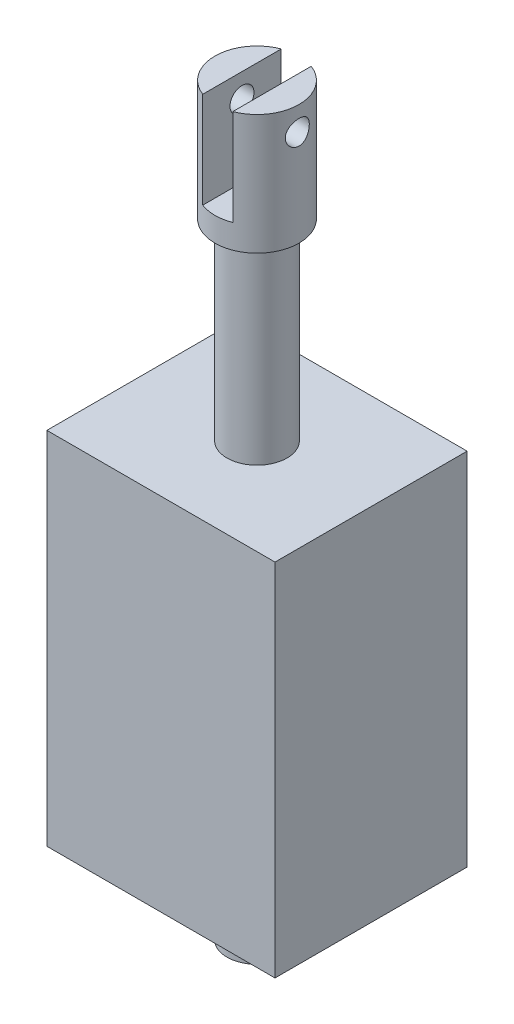
ISO-10303-21;
HEADER;
FILE_DESCRIPTION(('STEP AP214'),'2;1');
FILE_NAME('part.step','',(''),(''),'','','');
FILE_SCHEMA(('AUTOMOTIVE_DESIGN { 1 0 10303 214 1 1 1 1 }'));
ENDSEC;
DATA;
#1=APPLICATION_CONTEXT('core data for automotive mechanical design processes');
#2=APPLICATION_PROTOCOL_DEFINITION('international standard','automotive_design',2000,#1);
#3=PRODUCT_CONTEXT('',#1,'mechanical');
#4=PRODUCT('Part','Part','',(#3));
#5=PRODUCT_RELATED_PRODUCT_CATEGORY('part','',(#4));
#6=PRODUCT_DEFINITION_FORMATION('','',#4);
#7=PRODUCT_DEFINITION_CONTEXT('part definition',#1,'design');
#8=PRODUCT_DEFINITION('design','',#6,#7);
#9=PRODUCT_DEFINITION_SHAPE('','',#8);
#10=(LENGTH_UNIT() NAMED_UNIT(*) SI_UNIT(.MILLI.,.METRE.));
#11=(NAMED_UNIT(*) PLANE_ANGLE_UNIT() SI_UNIT($,.RADIAN.));
#12=(NAMED_UNIT(*) SI_UNIT($,.STERADIAN.) SOLID_ANGLE_UNIT());
#13=UNCERTAINTY_MEASURE_WITH_UNIT(LENGTH_MEASURE(1.E-05),#10,'distance_accuracy_value','');
#14=(GEOMETRIC_REPRESENTATION_CONTEXT(3) GLOBAL_UNCERTAINTY_ASSIGNED_CONTEXT((#13)) GLOBAL_UNIT_ASSIGNED_CONTEXT((#10,
#11,#12)) REPRESENTATION_CONTEXT('',''));
#15=CARTESIAN_POINT('',(0.,0.,0.));
#16=DIRECTION('',(0.,0.,1.));
#17=DIRECTION('',(1.,0.,0.));
#18=AXIS2_PLACEMENT_3D('',#15,#16,#17);
#19=CARTESIAN_POINT('',(0.,56.,0.));
#20=DIRECTION('',(0.,1.,0.));
#21=DIRECTION('',(0.,0.,1.));
#22=AXIS2_PLACEMENT_3D('',#19,#20,#21);
#23=PLANE('',#22);
#24=DIRECTION('',(0.,0.,1.));
#25=VECTOR('',#24,1.);
#26=CARTESIAN_POINT('',(-1.25,56.,-8.00000000000004));
#27=LINE('',#26,#25);
#28=CARTESIAN_POINT('',(-1.25,56.,-3.26917420765551));
#29=VERTEX_POINT('',#28);
#30=CARTESIAN_POINT('',(-1.25,56.,3.26917420765551));
#31=VERTEX_POINT('',#30);
#32=EDGE_CURVE('E198',#29,#31,#27,.T.);
#33=ORIENTED_EDGE('',*,*,#32,.F.);
#34=CARTESIAN_POINT('',(0.,56.,0.));
#35=DIRECTION('',(0.,1.,0.));
#36=DIRECTION('',(0.,0.,1.));
#37=AXIS2_PLACEMENT_3D('',#34,#35,#36);
#38=CIRCLE('',#37,3.5);
#39=EDGE_CURVE('E200',#29,#31,#38,.T.);
#40=ORIENTED_EDGE('',*,*,#39,.T.);
#41=EDGE_LOOP('',(#33,#40));
#42=FACE_BOUND('',#41,.T.);
#43=ADVANCED_FACE('F45',(#42),#23,.T.);
#44=CARTESIAN_POINT('',(-9.49999999999996,54.,0.));
#45=DIRECTION('',(1.,0.,0.));
#46=DIRECTION('',(0.,0.,-1.));
#47=AXIS2_PLACEMENT_3D('',#44,#45,#46);
#48=CYLINDRICAL_SURFACE('',#47,1.);
#49=CARTESIAN_POINT('',(-1.25,54.,0.));
#50=DIRECTION('',(-1.,0.,0.));
#51=DIRECTION('',(0.,-1.,0.));
#52=AXIS2_PLACEMENT_3D('',#49,#50,#51);
#53=CIRCLE('',#52,1.);
#54=CARTESIAN_POINT('',(-1.25,53.,0.));
#55=VERTEX_POINT('',#54);
#56=EDGE_CURVE('E266',#55,#55,#53,.F.);
#57=ORIENTED_EDGE('',*,*,#56,.T.);
#58=EDGE_LOOP('',(#57));
#59=FACE_BOUND('',#58,.T.);
#60=CARTESIAN_POINT('',(-3.35410196624968,54.,-1.));
#61=CARTESIAN_POINT('',(-3.3541027352982,54.0549257689227,-0.999999010234619));
#62=CARTESIAN_POINT('',(-3.35546589937234,54.1098615420798,-0.995459333009395));
#63=CARTESIAN_POINT('',(-3.36075194701915,54.2181356193875,-0.977461816962149));
#64=CARTESIAN_POINT('',(-3.36467587174621,54.2714732645416,-0.9640003506833));
#65=CARTESIAN_POINT('',(-3.37460354734501,54.3749686004512,-0.928646716460412));
#66=CARTESIAN_POINT('',(-3.38060407621639,54.4251310759127,-0.906767603258324));
#67=CARTESIAN_POINT('',(-3.39400460555119,54.521083905773,-0.855241820315746));
#68=CARTESIAN_POINT('',(-3.40140477214508,54.5668737401879,-0.825594228332021));
#69=CARTESIAN_POINT('',(-3.41700891605117,54.6540957826586,-0.758462400490703));
#70=CARTESIAN_POINT('',(-3.42522877981549,54.6953839010649,-0.720794605566173));
#71=CARTESIAN_POINT('',(-3.44140982756535,54.7711513916516,-0.639085622734719));
#72=CARTESIAN_POINT('',(-3.44937098116968,54.8056299665613,-0.595043689579842));
#73=CARTESIAN_POINT('',(-3.46431666000611,54.8674143241768,-0.500823016078778));
#74=CARTESIAN_POINT('',(-3.47128027250394,54.8945748098755,-0.450545391880933));
#75=CARTESIAN_POINT('',(-3.48326270242804,54.940000887208,-0.34590423761983));
#76=CARTESIAN_POINT('',(-3.48828189845443,54.9582682106201,-0.291541505437591));
#77=CARTESIAN_POINT('',(-3.49569759650108,54.9849172306199,-0.181779287560589));
#78=CARTESIAN_POINT('',(-3.49815913505649,54.9935445108523,-0.126443899064521));
#79=CARTESIAN_POINT('',(-3.50041047829849,55.0014433669416,-0.0150600512109633));
#80=CARTESIAN_POINT('',(-3.50020079369491,55.0007167311687,0.0409882697942736));
#81=CARTESIAN_POINT('',(-3.49718003381653,54.990096812541,0.15049009786761));
#82=CARTESIAN_POINT('',(-3.49444435388027,54.980469193681,0.203971773054473));
#83=CARTESIAN_POINT('',(-3.48676943165067,54.9527524487678,0.308526111088809));
#84=CARTESIAN_POINT('',(-3.48183005528105,54.9346628078689,0.359598627150255));
#85=CARTESIAN_POINT('',(-3.47019515886062,54.8903452995941,0.458536916864462));
#86=CARTESIAN_POINT('',(-3.46348102756093,54.8640306110958,0.506361521925386));
#87=CARTESIAN_POINT('',(-3.44901384486994,54.804077706801,0.59700362179524));
#88=CARTESIAN_POINT('',(-3.44126056595877,54.7704378861668,0.639820016208002));
#89=CARTESIAN_POINT('',(-3.42522841509913,54.6953971446907,0.720816324273875));
#90=CARTESIAN_POINT('',(-3.41694064685079,54.6537652831974,0.758780788792451));
#91=CARTESIAN_POINT('',(-3.4010148689311,54.5646424540771,0.827246507874875));
#92=CARTESIAN_POINT('',(-3.39337691201241,54.5171510115256,0.857747156891286));
#93=CARTESIAN_POINT('',(-3.37957587408658,54.4171345577509,0.910616679927255));
#94=CARTESIAN_POINT('',(-3.37342505474766,54.3645723874737,0.932918688943926));
#95=CARTESIAN_POINT('',(-3.36344272188227,54.2562234182481,0.968294757480382));
#96=CARTESIAN_POINT('',(-3.35961053356453,54.2004375626717,0.981371502013291));
#97=CARTESIAN_POINT('',(-3.35484557617748,54.0892597878381,0.997537085998827));
#98=CARTESIAN_POINT('',(-3.35381855730447,54.0339190915396,1.00095074078696));
#99=CARTESIAN_POINT('',(-3.35452079870229,53.9234558420425,0.998594983598456));
#100=CARTESIAN_POINT('',(-3.35624971515342,53.8683332624927,0.992826717122486));
#101=CARTESIAN_POINT('',(-3.36217715008271,53.7611793859847,0.97255890712929));
#102=CARTESIAN_POINT('',(-3.3663182147774,53.7091062069914,0.958262310920607));
#103=CARTESIAN_POINT('',(-3.37654531970352,53.6080990640021,0.921575809332241));
#104=CARTESIAN_POINT('',(-3.38263164056921,53.5591655541774,0.899184736133866));
#105=CARTESIAN_POINT('',(-3.3962509400331,53.4644889623913,0.846309825608092));
#106=CARTESIAN_POINT('',(-3.40381598690189,53.4188547778988,0.815639458645652));
#107=CARTESIAN_POINT('',(-3.41946863275287,53.3332618132784,0.747302318424217));
#108=CARTESIAN_POINT('',(-3.42755634473907,53.2933042664939,0.709634028840688));
#109=CARTESIAN_POINT('',(-3.44367363717939,53.2188102908559,0.626854004982778));
#110=CARTESIAN_POINT('',(-3.45169203023043,53.1845025142906,0.581533855120275));
#111=CARTESIAN_POINT('',(-3.46648988523027,53.1239771593086,0.485592653528774));
#112=CARTESIAN_POINT('',(-3.47326941192714,53.0977591580388,0.434971879049092));
#113=CARTESIAN_POINT('',(-3.48478252423195,53.0544078564868,0.330216636478082));
#114=CARTESIAN_POINT('',(-3.48953154063622,53.0372058052069,0.276112399949816));
#115=CARTESIAN_POINT('',(-3.49651669811944,53.0121865990299,0.16562282427496));
#116=CARTESIAN_POINT('',(-3.4987534856151,53.0043670299093,0.109238075792718));
#117=CARTESIAN_POINT('',(-3.50042667501642,52.9985042830011,-0.00208911897951537));
#118=CARTESIAN_POINT('',(-3.49995851794498,53.0001279254586,-0.0570128155249792));
#119=CARTESIAN_POINT('',(-3.49649534561067,53.0123191407051,-0.165772586211003));
#120=CARTESIAN_POINT('',(-3.49350045135296,53.022886285191,-0.219608712308766));
#121=CARTESIAN_POINT('',(-3.48534400930059,53.0524656804894,-0.324202066519794));
#122=CARTESIAN_POINT('',(-3.4802020702409,53.071401589472,-0.374982516717526));
#123=CARTESIAN_POINT('',(-3.46828547071724,53.1171130791427,-0.472673601380731));
#124=CARTESIAN_POINT('',(-3.46151055750883,53.1438898735461,-0.519583635290339));
#125=CARTESIAN_POINT('',(-3.44679477720104,53.2054486687124,-0.609716728176953));
#126=CARTESIAN_POINT('',(-3.43882522893152,53.2404450433942,-0.652788664003536));
#127=CARTESIAN_POINT('',(-3.42272032493228,53.317054562727,-0.732560611159187));
#128=CARTESIAN_POINT('',(-3.4145849239342,53.3586695355424,-0.769258856094887));
#129=CARTESIAN_POINT('',(-3.39882018772077,53.4486484584977,-0.836204230145643));
#130=CARTESIAN_POINT('',(-3.39120975884781,53.4971609737516,-0.866256583618024));
#131=CARTESIAN_POINT('',(-3.37764222665283,53.5987609326575,-0.91773971809804));
#132=CARTESIAN_POINT('',(-3.37168419857914,53.6518457955448,-0.93917532442409));
#133=CARTESIAN_POINT('',(-3.36279229780033,53.7538268501157,-0.970492670062523));
#134=CARTESIAN_POINT('',(-3.3595621942308,53.8023451740493,-0.981529499909266));
#135=CARTESIAN_POINT('',(-3.35521684727178,53.900573059178,-0.996283035217831));
#136=CARTESIAN_POINT('',(-3.35410127012429,53.950282431123,-1.00000089591333));
#137=CARTESIAN_POINT('',(-3.35410196624968,54.,-1.));
#138=B_SPLINE_CURVE_WITH_KNOTS('',3,(#60,#61,#62,#63,#64,#65,#66,#67,#68,#69,#70,#71,#72,#73,
#74,#75,#76,#77,#78,#79,#80,#81,#82,#83,#84,#85,#86,#87,#88,#89,#90,#91,#92,#93,#94,#95,#96,#97,
#98,#99,#100,#101,#102,#103,#104,#105,#106,#107,#108,#109,#110,#111,#112,#113,#114,#115,#116,
#117,#118,#119,#120,#121,#122,#123,#124,#125,#126,#127,#128,#129,#130,#131,#132,#133,#134,#135,
#136,#137),.UNSPECIFIED.,.T.,.F.,(4,2,2,2,2,2,2,2,2,2,2,2,2,2,2,2,2,2,2,2,2,2,2,2,2,2,2,2,2,2,2,
2,2,2,2,2,2,2,4),(0.,0.164594171159105,0.32925530476515,0.493662091823929,0.658088405459392,
0.826785835988794,0.995503006148128,1.16735741502495,1.33917834504425,1.50651450509943,
1.67381867271781,1.83628518817283,1.99876158968833,2.16301451684818,2.32730346587989,
2.49735806342072,2.66742645310452,2.83885260310575,3.01022883892078,3.17577181660546,
3.34129414341279,3.5030264482031,3.66478209600075,3.83054003013244,3.99633392302106,
4.16772694180382,4.33911100034378,4.50916842641099,4.67918208530373,4.84323448834084,
5.00727903537341,5.16985706186659,5.33246026763666,5.4998988436474,5.66738374949711,
5.83926806202707,6.0110559859988,6.16006644425301,6.30905338065555),.UNSPECIFIED.);
#139=CARTESIAN_POINT('',(-3.35410196624968,54.,-1.));
#140=VERTEX_POINT('',#139);
#141=EDGE_CURVE('E147',#140,#140,#138,.T.);
#142=ORIENTED_EDGE('',*,*,#141,.F.);
#143=EDGE_LOOP('',(#142));
#144=FACE_BOUND('',#143,.T.);
#145=ADVANCED_FACE('F171',(#59,#144),#48,.F.);
#146=CARTESIAN_POINT('',(9.50000000000004,30.,7.99999999999992));
#147=DIRECTION('',(-1.,0.,0.));
#148=DIRECTION('',(0.,0.,1.));
#149=AXIS2_PLACEMENT_3D('',#146,#147,#148);
#150=PLANE('',#149);
#151=DIRECTION('',(0.,0.,-1.));
#152=VECTOR('',#151,1.);
#153=CARTESIAN_POINT('',(9.50000000000004,0.,7.99999999999992));
#154=LINE('',#153,#152);
#155=CARTESIAN_POINT('',(9.50000000000004,0.,7.99999999999992));
#156=VERTEX_POINT('',#155);
#157=CARTESIAN_POINT('',(9.50000000000004,0.,-8.00000000000004));
#158=VERTEX_POINT('',#157);
#159=EDGE_CURVE('E205',#156,#158,#154,.T.);
#160=ORIENTED_EDGE('',*,*,#159,.T.);
#161=DIRECTION('',(0.,-1.,0.));
#162=VECTOR('',#161,1.);
#163=CARTESIAN_POINT('',(9.50000000000004,30.,-8.00000000000004));
#164=LINE('',#163,#162);
#165=CARTESIAN_POINT('',(9.50000000000004,30.,-8.00000000000004));
#166=VERTEX_POINT('',#165);
#167=EDGE_CURVE('E229',#166,#158,#164,.T.);
#168=ORIENTED_EDGE('',*,*,#167,.F.);
#169=DIRECTION('',(0.,0.,-1.));
#170=VECTOR('',#169,1.);
#171=CARTESIAN_POINT('',(9.50000000000004,30.,7.99999999999992));
#172=LINE('',#171,#170);
#173=CARTESIAN_POINT('',(9.50000000000004,30.,7.99999999999992));
#174=VERTEX_POINT('',#173);
#175=EDGE_CURVE('E210',#174,#166,#172,.T.);
#176=ORIENTED_EDGE('',*,*,#175,.F.);
#177=DIRECTION('',(0.,-1.,0.));
#178=VECTOR('',#177,1.);
#179=CARTESIAN_POINT('',(9.50000000000004,30.,7.99999999999992));
#180=LINE('',#179,#178);
#181=EDGE_CURVE('E216',#174,#156,#180,.T.);
#182=ORIENTED_EDGE('',*,*,#181,.T.);
#183=EDGE_LOOP('',(#160,#168,#176,#182));
#184=FACE_BOUND('',#183,.T.);
#185=ADVANCED_FACE('F47',(#184),#150,.F.);
#186=CARTESIAN_POINT('',(-9.49999999999996,30.,-8.00000000000004));
#187=DIRECTION('',(0.,0.,1.));
#188=DIRECTION('',(1.,0.,0.));
#189=AXIS2_PLACEMENT_3D('',#186,#187,#188);
#190=PLANE('',#189);
#191=DIRECTION('',(-1.,0.,0.));
#192=VECTOR('',#191,1.);
#193=CARTESIAN_POINT('',(-9.49999999999996,0.,-8.00000000000004));
#194=LINE('',#193,#192);
#195=CARTESIAN_POINT('',(-9.49999999999996,0.,-8.00000000000004));
#196=VERTEX_POINT('',#195);
#197=EDGE_CURVE('E219',#158,#196,#194,.T.);
#198=ORIENTED_EDGE('',*,*,#197,.T.);
#199=DIRECTION('',(0.,-1.,0.));
#200=VECTOR('',#199,1.);
#201=CARTESIAN_POINT('',(-9.49999999999996,30.,-8.00000000000004));
#202=LINE('',#201,#200);
#203=CARTESIAN_POINT('',(-9.49999999999996,30.,-8.00000000000004));
#204=VERTEX_POINT('',#203);
#205=EDGE_CURVE('E227',#204,#196,#202,.T.);
#206=ORIENTED_EDGE('',*,*,#205,.F.);
#207=DIRECTION('',(-1.,0.,0.));
#208=VECTOR('',#207,1.);
#209=CARTESIAN_POINT('',(-9.49999999999996,30.,-8.00000000000004));
#210=LINE('',#209,#208);
#211=EDGE_CURVE('E98',#166,#204,#210,.T.);
#212=ORIENTED_EDGE('',*,*,#211,.F.);
#213=ORIENTED_EDGE('',*,*,#167,.T.);
#214=EDGE_LOOP('',(#198,#206,#212,#213));
#215=FACE_BOUND('',#214,.T.);
#216=ADVANCED_FACE('F248',(#215),#190,.F.);
#217=CARTESIAN_POINT('',(-9.49999999999996,30.,7.99999999999992));
#218=DIRECTION('',(1.,0.,0.));
#219=DIRECTION('',(0.,0.,-1.));
#220=AXIS2_PLACEMENT_3D('',#217,#218,#219);
#221=PLANE('',#220);
#222=DIRECTION('',(0.,0.,1.));
#223=VECTOR('',#222,1.);
#224=CARTESIAN_POINT('',(-9.49999999999996,0.,7.99999999999992));
#225=LINE('',#224,#223);
#226=CARTESIAN_POINT('',(-9.49999999999996,0.,7.99999999999992));
#227=VERTEX_POINT('',#226);
#228=EDGE_CURVE('E221',#196,#227,#225,.T.);
#229=ORIENTED_EDGE('',*,*,#228,.T.);
#230=DIRECTION('',(0.,-1.,0.));
#231=VECTOR('',#230,1.);
#232=CARTESIAN_POINT('',(-9.49999999999996,30.,7.99999999999992));
#233=LINE('',#232,#231);
#234=CARTESIAN_POINT('',(-9.49999999999996,30.,7.99999999999992));
#235=VERTEX_POINT('',#234);
#236=EDGE_CURVE('E225',#235,#227,#233,.T.);
#237=ORIENTED_EDGE('',*,*,#236,.F.);
#238=DIRECTION('',(0.,0.,1.));
#239=VECTOR('',#238,1.);
#240=CARTESIAN_POINT('',(-9.49999999999996,30.,7.99999999999992));
#241=LINE('',#240,#239);
#242=EDGE_CURVE('E213',#204,#235,#241,.T.);
#243=ORIENTED_EDGE('',*,*,#242,.F.);
#244=ORIENTED_EDGE('',*,*,#205,.T.);
#245=EDGE_LOOP('',(#229,#237,#243,#244));
#246=FACE_BOUND('',#245,.T.);
#247=ADVANCED_FACE('F247',(#246),#221,.F.);
#248=CARTESIAN_POINT('',(-9.49999999999996,30.,7.99999999999992));
#249=DIRECTION('',(0.,0.,-1.));
#250=DIRECTION('',(-1.,0.,0.));
#251=AXIS2_PLACEMENT_3D('',#248,#249,#250);
#252=PLANE('',#251);
#253=DIRECTION('',(1.,0.,0.));
#254=VECTOR('',#253,1.);
#255=CARTESIAN_POINT('',(-9.49999999999996,0.,7.99999999999992));
#256=LINE('',#255,#254);
#257=EDGE_CURVE('E90',#227,#156,#256,.T.);
#258=ORIENTED_EDGE('',*,*,#257,.T.);
#259=ORIENTED_EDGE('',*,*,#181,.F.);
#260=DIRECTION('',(1.,0.,0.));
#261=VECTOR('',#260,1.);
#262=CARTESIAN_POINT('',(-9.49999999999996,30.,7.99999999999992));
#263=LINE('',#262,#261);
#264=EDGE_CURVE('E69',#235,#174,#263,.T.);
#265=ORIENTED_EDGE('',*,*,#264,.F.);
#266=ORIENTED_EDGE('',*,*,#236,.T.);
#267=EDGE_LOOP('',(#258,#259,#265,#266));
#268=FACE_BOUND('',#267,.T.);
#269=ADVANCED_FACE('F243',(#268),#252,.F.);
#270=CARTESIAN_POINT('',(0.,30.,0.));
#271=DIRECTION('',(0.,-1.,0.));
#272=DIRECTION('',(0.,0.,-1.));
#273=AXIS2_PLACEMENT_3D('',#270,#271,#272);
#274=PLANE('',#273);
#275=ORIENTED_EDGE('',*,*,#175,.T.);
#276=ORIENTED_EDGE('',*,*,#211,.T.);
#277=ORIENTED_EDGE('',*,*,#242,.T.);
#278=ORIENTED_EDGE('',*,*,#264,.T.);
#279=EDGE_LOOP('',(#275,#276,#277,#278));
#280=FACE_BOUND('',#279,.T.);
#281=CARTESIAN_POINT('',(0.,30.,0.));
#282=DIRECTION('',(0.,1.,0.));
#283=DIRECTION('',(0.,0.,1.));
#284=AXIS2_PLACEMENT_3D('',#281,#282,#283);
#285=CIRCLE('',#284,2.5);
#286=CARTESIAN_POINT('',(0.,30.,2.5));
#287=VERTEX_POINT('',#286);
#288=EDGE_CURVE('E263',#287,#287,#285,.T.);
#289=ORIENTED_EDGE('',*,*,#288,.F.);
#290=EDGE_LOOP('',(#289));
#291=FACE_BOUND('',#290,.T.);
#292=ADVANCED_FACE('F237',(#280,#291),#274,.F.);
#293=CARTESIAN_POINT('',(0.,0.,0.));
#294=DIRECTION('',(0.,-1.,0.));
#295=DIRECTION('',(0.,0.,-1.));
#296=AXIS2_PLACEMENT_3D('',#293,#294,#295);
#297=PLANE('',#296);
#298=CARTESIAN_POINT('',(0.,0.,0.));
#299=DIRECTION('',(0.,-1.,0.));
#300=DIRECTION('',(0.,0.,-1.));
#301=AXIS2_PLACEMENT_3D('',#298,#299,#300);
#302=CIRCLE('',#301,2.5);
#303=CARTESIAN_POINT('',(0.,0.,-2.5));
#304=VERTEX_POINT('',#303);
#305=EDGE_CURVE('E146',#304,#304,#302,.T.);
#306=ORIENTED_EDGE('',*,*,#305,.F.);
#307=EDGE_LOOP('',(#306));
#308=FACE_BOUND('',#307,.T.);
#309=ORIENTED_EDGE('',*,*,#159,.F.);
#310=ORIENTED_EDGE('',*,*,#257,.F.);
#311=ORIENTED_EDGE('',*,*,#228,.F.);
#312=ORIENTED_EDGE('',*,*,#197,.F.);
#313=EDGE_LOOP('',(#309,#310,#311,#312));
#314=FACE_BOUND('',#313,.T.);
#315=ADVANCED_FACE('F181',(#308,#314),#297,.T.);
#316=CARTESIAN_POINT('',(0.,-6.,0.));
#317=DIRECTION('',(0.,1.,0.));
#318=DIRECTION('',(0.,0.,1.));
#319=AXIS2_PLACEMENT_3D('',#316,#317,#318);
#320=CYLINDRICAL_SURFACE('',#319,2.5);
#321=CARTESIAN_POINT('',(0.,-6.,0.));
#322=DIRECTION('',(0.,-1.,0.));
#323=DIRECTION('',(0.,0.,-1.));
#324=AXIS2_PLACEMENT_3D('',#321,#322,#323);
#325=CIRCLE('',#324,2.5);
#326=CARTESIAN_POINT('',(0.,-6.,-2.5));
#327=VERTEX_POINT('',#326);
#328=EDGE_CURVE('E155',#327,#327,#325,.T.);
#329=ORIENTED_EDGE('',*,*,#328,.F.);
#330=EDGE_LOOP('',(#329));
#331=FACE_BOUND('',#330,.T.);
#332=ORIENTED_EDGE('',*,*,#305,.T.);
#333=EDGE_LOOP('',(#332));
#334=FACE_BOUND('',#333,.T.);
#335=ADVANCED_FACE('F178',(#331,#334),#320,.T.);
#336=CARTESIAN_POINT('',(0.,-6.,0.));
#337=DIRECTION('',(0.,-1.,0.));
#338=DIRECTION('',(0.,0.,-1.));
#339=AXIS2_PLACEMENT_3D('',#336,#337,#338);
#340=PLANE('',#339);
#341=ORIENTED_EDGE('',*,*,#328,.T.);
#342=EDGE_LOOP('',(#341));
#343=FACE_BOUND('',#342,.T.);
#344=ADVANCED_FACE('F174',(#343),#340,.T.);
#345=CARTESIAN_POINT('',(0.,46.,0.));
#346=DIRECTION('',(0.,1.,0.));
#347=DIRECTION('',(0.,0.,1.));
#348=AXIS2_PLACEMENT_3D('',#345,#346,#347);
#349=PLANE('',#348);
#350=CARTESIAN_POINT('',(0.,46.,0.));
#351=DIRECTION('',(0.,1.,0.));
#352=DIRECTION('',(0.,0.,1.));
#353=AXIS2_PLACEMENT_3D('',#350,#351,#352);
#354=CIRCLE('',#353,3.5);
#355=CARTESIAN_POINT('',(0.,46.,3.5));
#356=VERTEX_POINT('',#355);
#357=EDGE_CURVE('E269',#356,#356,#354,.T.);
#358=ORIENTED_EDGE('',*,*,#357,.F.);
#359=EDGE_LOOP('',(#358));
#360=FACE_BOUND('',#359,.T.);
#361=CARTESIAN_POINT('',(0.,46.,0.));
#362=DIRECTION('',(0.,1.,0.));
#363=DIRECTION('',(0.,0.,1.));
#364=AXIS2_PLACEMENT_3D('',#361,#362,#363);
#365=CIRCLE('',#364,2.5);
#366=CARTESIAN_POINT('',(0.,46.,2.5));
#367=VERTEX_POINT('',#366);
#368=EDGE_CURVE('E265',#367,#367,#365,.T.);
#369=ORIENTED_EDGE('',*,*,#368,.T.);
#370=EDGE_LOOP('',(#369));
#371=FACE_BOUND('',#370,.T.);
#372=ADVANCED_FACE('F172',(#360,#371),#349,.F.);
#373=CARTESIAN_POINT('',(0.,46.,0.));
#374=DIRECTION('',(0.,-1.,0.));
#375=DIRECTION('',(0.,0.,-1.));
#376=AXIS2_PLACEMENT_3D('',#373,#374,#375);
#377=CYLINDRICAL_SURFACE('',#376,2.5);
#378=ORIENTED_EDGE('',*,*,#368,.F.);
#379=EDGE_LOOP('',(#378));
#380=FACE_BOUND('',#379,.T.);
#381=ORIENTED_EDGE('',*,*,#288,.T.);
#382=EDGE_LOOP('',(#381));
#383=FACE_BOUND('',#382,.T.);
#384=ADVANCED_FACE('F184',(#380,#383),#377,.T.);
#385=DIRECTION('',(0.,0.,1.));
#386=VECTOR('',#385,1.);
#387=CARTESIAN_POINT('',(1.25,56.,-8.00000000000004));
#388=LINE('',#387,#386);
#389=CARTESIAN_POINT('',(1.25,56.,-3.26917420765551));
#390=VERTEX_POINT('',#389);
#391=CARTESIAN_POINT('',(1.25,56.,3.26917420765551));
#392=VERTEX_POINT('',#391);
#393=EDGE_CURVE('E135',#390,#392,#388,.T.);
#394=ORIENTED_EDGE('',*,*,#393,.T.);
#395=EDGE_CURVE('E141',#392,#390,#38,.T.);
#396=ORIENTED_EDGE('',*,*,#395,.T.);
#397=EDGE_LOOP('',(#394,#396));
#398=FACE_BOUND('',#397,.T.);
#399=ADVANCED_FACE('F169',(#398),#23,.T.);
#400=CARTESIAN_POINT('',(1.25,54.,0.));
#401=DIRECTION('',(1.,0.,0.));
#402=DIRECTION('',(0.,1.,0.));
#403=AXIS2_PLACEMENT_3D('',#400,#401,#402);
#404=CIRCLE('',#403,1.);
#405=CARTESIAN_POINT('',(1.25,55.,0.));
#406=VERTEX_POINT('',#405);
#407=EDGE_CURVE('E202',#406,#406,#404,.F.);
#408=ORIENTED_EDGE('',*,*,#407,.T.);
#409=EDGE_LOOP('',(#408));
#410=FACE_BOUND('',#409,.T.);
#411=CARTESIAN_POINT('',(3.35410196624969,54.,-1.));
#412=CARTESIAN_POINT('',(3.3541027352982,53.9450742310772,-0.999999010234619));
#413=CARTESIAN_POINT('',(3.35546589937234,53.8901384579202,-0.995459333009394));
#414=CARTESIAN_POINT('',(3.36075194701915,53.7818643806124,-0.97746181696215));
#415=CARTESIAN_POINT('',(3.36467587174621,53.7285267354584,-0.9640003506833));
#416=CARTESIAN_POINT('',(3.37460354734501,53.6250313995488,-0.92864671646041));
#417=CARTESIAN_POINT('',(3.38060407621639,53.5748689240873,-0.90676760325832));
#418=CARTESIAN_POINT('',(3.3940046055512,53.478916094227,-0.855241820315741));
#419=CARTESIAN_POINT('',(3.40140477214508,53.4331262598121,-0.825594228332019));
#420=CARTESIAN_POINT('',(3.41700891605117,53.3459042173414,-0.758462400490704));
#421=CARTESIAN_POINT('',(3.42522877981549,53.3046160989351,-0.720794605566173));
#422=CARTESIAN_POINT('',(3.44140982756535,53.2288486083484,-0.639085622734719));
#423=CARTESIAN_POINT('',(3.44937098116968,53.1943700334387,-0.595043689579842));
#424=CARTESIAN_POINT('',(3.46431666000611,53.1325856758232,-0.500823016078778));
#425=CARTESIAN_POINT('',(3.47128027250394,53.1054251901245,-0.450545391880933));
#426=CARTESIAN_POINT('',(3.48326270242804,53.059999112792,-0.34590423761983));
#427=CARTESIAN_POINT('',(3.48828189845443,53.0417317893799,-0.29154150543759));
#428=CARTESIAN_POINT('',(3.49569759650108,53.0150827693801,-0.181779287560589));
#429=CARTESIAN_POINT('',(3.49815913505649,53.0064554891477,-0.126443899064521));
#430=CARTESIAN_POINT('',(3.50041047829849,52.9985566330584,-0.0150600512109628));
#431=CARTESIAN_POINT('',(3.50020079369491,52.9992832688313,0.0409882697942741));
#432=CARTESIAN_POINT('',(3.49718003381653,53.009903187459,0.150490097867611));
#433=CARTESIAN_POINT('',(3.49444435388027,53.019530806319,0.203971773054473));
#434=CARTESIAN_POINT('',(3.48676943165067,53.0472475512322,0.308526111088809));
#435=CARTESIAN_POINT('',(3.48183005528105,53.0653371921311,0.359598627150255));
#436=CARTESIAN_POINT('',(3.47019515886062,53.1096547004059,0.458536916864462));
#437=CARTESIAN_POINT('',(3.46348102756093,53.1359693889042,0.506361521925386));
#438=CARTESIAN_POINT('',(3.44901384486994,53.195922293199,0.59700362179524));
#439=CARTESIAN_POINT('',(3.44126056595877,53.2295621138332,0.639820016208003));
#440=CARTESIAN_POINT('',(3.42522841509913,53.3046028553093,0.720816324273877));
#441=CARTESIAN_POINT('',(3.41694064685079,53.3462347168025,0.758780788792453));
#442=CARTESIAN_POINT('',(3.4010148689311,53.4353575459229,0.827246507874877));
#443=CARTESIAN_POINT('',(3.39337691201241,53.4828489884744,0.857747156891287));
#444=CARTESIAN_POINT('',(3.37957587408658,53.5828654422491,0.910616679927256));
#445=CARTESIAN_POINT('',(3.37342505474766,53.6354276125263,0.932918688943928));
#446=CARTESIAN_POINT('',(3.36344272188227,53.7437765817519,0.968294757480382));
#447=CARTESIAN_POINT('',(3.35961053356453,53.7995624373283,0.981371502013291));
#448=CARTESIAN_POINT('',(3.35484557617748,53.9107402121619,0.997537085998827));
#449=CARTESIAN_POINT('',(3.35381855730447,53.9660809084604,1.00095074078696));
#450=CARTESIAN_POINT('',(3.35452079870229,54.0765441579575,0.998594983598456));
#451=CARTESIAN_POINT('',(3.35624971515342,54.1316667375073,0.992826717122486));
#452=CARTESIAN_POINT('',(3.36217715008271,54.2388206140153,0.97255890712929));
#453=CARTESIAN_POINT('',(3.3663182147774,54.2908937930086,0.958262310920607));
#454=CARTESIAN_POINT('',(3.37654531970352,54.3919009359978,0.921575809332241));
#455=CARTESIAN_POINT('',(3.38263164056921,54.4408344458225,0.899184736133866));
#456=CARTESIAN_POINT('',(3.3962509400331,54.5355110376087,0.846309825608092));
#457=CARTESIAN_POINT('',(3.40381598690189,54.5811452221012,0.815639458645652));
#458=CARTESIAN_POINT('',(3.41946863275287,54.6667381867216,0.747302318424217));
#459=CARTESIAN_POINT('',(3.42755634473907,54.706695733506,0.709634028840688));
#460=CARTESIAN_POINT('',(3.44367363717939,54.7811897091441,0.626854004982778));
#461=CARTESIAN_POINT('',(3.45169203023043,54.8154974857094,0.581533855120275));
#462=CARTESIAN_POINT('',(3.46648988523027,54.8760228406914,0.485592653528774));
#463=CARTESIAN_POINT('',(3.47326941192714,54.9022408419612,0.434971879049091));
#464=CARTESIAN_POINT('',(3.48478252423195,54.9455921435132,0.33021663647808));
#465=CARTESIAN_POINT('',(3.48953154063622,54.9627941947931,0.276112399949815));
#466=CARTESIAN_POINT('',(3.49651669811944,54.9878134009701,0.165622824274958));
#467=CARTESIAN_POINT('',(3.4987534856151,54.9956329700907,0.109238075792717));
#468=CARTESIAN_POINT('',(3.50042667501642,55.0014957169989,-0.00208911897951597));
#469=CARTESIAN_POINT('',(3.49995851794498,54.9998720745414,-0.0570128155249796));
#470=CARTESIAN_POINT('',(3.49649534561067,54.9876808592948,-0.165772586211003));
#471=CARTESIAN_POINT('',(3.49350045135296,54.977113714809,-0.219608712308767));
#472=CARTESIAN_POINT('',(3.48534400930059,54.9475343195106,-0.324202066519795));
#473=CARTESIAN_POINT('',(3.4802020702409,54.928598410528,-0.374982516717526));
#474=CARTESIAN_POINT('',(3.46828547071724,54.8828869208573,-0.472673601380731));
#475=CARTESIAN_POINT('',(3.46151055750883,54.8561101264539,-0.51958363529034));
#476=CARTESIAN_POINT('',(3.44679477720104,54.7945513312876,-0.609716728176955));
#477=CARTESIAN_POINT('',(3.43882522893152,54.7595549566058,-0.652788664003539));
#478=CARTESIAN_POINT('',(3.42272032493228,54.682945437273,-0.732560611159189));
#479=CARTESIAN_POINT('',(3.4145849239342,54.6413304644575,-0.769258856094889));
#480=CARTESIAN_POINT('',(3.39882018772077,54.5513515415023,-0.836204230145644));
#481=CARTESIAN_POINT('',(3.39120975884781,54.5028390262484,-0.866256583618025));
#482=CARTESIAN_POINT('',(3.37764222665284,54.4012390673425,-0.917739718098038));
#483=CARTESIAN_POINT('',(3.37168419857914,54.3481542044552,-0.939175324424088));
#484=CARTESIAN_POINT('',(3.36279229780033,54.2461731498842,-0.970492670062521));
#485=CARTESIAN_POINT('',(3.3595621942308,54.1976548259507,-0.981529499909265));
#486=CARTESIAN_POINT('',(3.35521684727178,54.099426940822,-0.99628303521783));
#487=CARTESIAN_POINT('',(3.35410127012429,54.049717568877,-1.00000089591333));
#488=CARTESIAN_POINT('',(3.35410196624969,54.,-1.));
#489=B_SPLINE_CURVE_WITH_KNOTS('',3,(#411,#412,#413,#414,#415,#416,#417,#418,#419,#420,#421,
#422,#423,#424,#425,#426,#427,#428,#429,#430,#431,#432,#433,#434,#435,#436,#437,#438,#439,#440,
#441,#442,#443,#444,#445,#446,#447,#448,#449,#450,#451,#452,#453,#454,#455,#456,#457,#458,#459,
#460,#461,#462,#463,#464,#465,#466,#467,#468,#469,#470,#471,#472,#473,#474,#475,#476,#477,#478,
#479,#480,#481,#482,#483,#484,#485,#486,#487,#488),.UNSPECIFIED.,.T.,.F.,(4,2,2,2,2,2,2,2,2,2,2,
2,2,2,2,2,2,2,2,2,2,2,2,2,2,2,2,2,2,2,2,2,2,2,2,2,2,2,4),(0.,0.164594171159105,0.32925530476515,
0.493662091823938,0.658088405459392,0.826785835988794,0.995503006148128,1.16735741502495,
1.33917834504425,1.50651450509943,1.67381867271781,1.83628518817283,1.99876158968833,
2.16301451684818,2.32730346587989,2.49735806342072,2.66742645310452,2.83885260310575,
3.01022883892078,3.17577181660546,3.34129414341278,3.5030264482031,3.66478209600075,
3.83054003013244,3.99633392302106,4.16772694180382,4.33911100034378,4.50916842641099,
4.67918208530373,4.84323448834084,5.00727903537341,5.16985706186659,5.33246026763665,
5.4998988436474,5.66738374949711,5.83926806202707,6.01105598599879,6.160066444253,
6.30905338065555),.UNSPECIFIED.);
#490=CARTESIAN_POINT('',(3.35410196624969,54.,-1.));
#491=VERTEX_POINT('',#490);
#492=EDGE_CURVE('E156',#491,#491,#489,.T.);
#493=ORIENTED_EDGE('',*,*,#492,.F.);
#494=EDGE_LOOP('',(#493));
#495=FACE_BOUND('',#494,.T.);
#496=ADVANCED_FACE('F164',(#410,#495),#48,.F.);
#497=CARTESIAN_POINT('',(0.,56.,0.));
#498=DIRECTION('',(0.,-1.,0.));
#499=DIRECTION('',(0.,0.,-1.));
#500=AXIS2_PLACEMENT_3D('',#497,#498,#499);
#501=CYLINDRICAL_SURFACE('',#500,3.5);
#502=CARTESIAN_POINT('',(0.,48.,0.));
#503=DIRECTION('',(0.,-1.,0.));
#504=DIRECTION('',(0.,0.,-1.));
#505=AXIS2_PLACEMENT_3D('',#502,#503,#504);
#506=CIRCLE('',#505,3.5);
#507=CARTESIAN_POINT('',(1.25,48.,3.2691742076555));
#508=VERTEX_POINT('',#507);
#509=CARTESIAN_POINT('',(-1.25,48.,3.26917420765551));
#510=VERTEX_POINT('',#509);
#511=EDGE_CURVE('E119',#508,#510,#506,.T.);
#512=ORIENTED_EDGE('',*,*,#511,.T.);
#513=DIRECTION('',(0.,-1.,0.));
#514=VECTOR('',#513,1.);
#515=CARTESIAN_POINT('',(-1.25,56.,3.2691742076555));
#516=LINE('',#515,#514);
#517=EDGE_CURVE('E12',#510,#31,#516,.F.);
#518=ORIENTED_EDGE('',*,*,#517,.T.);
#519=ORIENTED_EDGE('',*,*,#39,.F.);
#520=DIRECTION('',(0.,-1.,0.));
#521=VECTOR('',#520,1.);
#522=CARTESIAN_POINT('',(-1.25,56.,-3.2691742076555));
#523=LINE('',#522,#521);
#524=CARTESIAN_POINT('',(-1.25,48.,-3.26917420765551));
#525=VERTEX_POINT('',#524);
#526=EDGE_CURVE('E125',#29,#525,#523,.T.);
#527=ORIENTED_EDGE('',*,*,#526,.T.);
#528=CARTESIAN_POINT('',(1.25,48.,-3.2691742076555));
#529=VERTEX_POINT('',#528);
#530=EDGE_CURVE('E127',#525,#529,#506,.T.);
#531=ORIENTED_EDGE('',*,*,#530,.T.);
#532=DIRECTION('',(0.,-1.,0.));
#533=VECTOR('',#532,1.);
#534=CARTESIAN_POINT('',(1.25,56.,-3.2691742076555));
#535=LINE('',#534,#533);
#536=EDGE_CURVE('E133',#529,#390,#535,.F.);
#537=ORIENTED_EDGE('',*,*,#536,.T.);
#538=ORIENTED_EDGE('',*,*,#395,.F.);
#539=DIRECTION('',(0.,-1.,0.));
#540=VECTOR('',#539,1.);
#541=CARTESIAN_POINT('',(1.25,56.,3.2691742076555));
#542=LINE('',#541,#540);
#543=EDGE_CURVE('E53',#392,#508,#542,.T.);
#544=ORIENTED_EDGE('',*,*,#543,.T.);
#545=EDGE_LOOP('',(#512,#518,#519,#527,#531,#537,#538,#544));
#546=FACE_BOUND('',#545,.T.);
#547=ORIENTED_EDGE('',*,*,#357,.T.);
#548=EDGE_LOOP('',(#547));
#549=FACE_BOUND('',#548,.T.);
#550=ORIENTED_EDGE('',*,*,#141,.T.);
#551=EDGE_LOOP('',(#550));
#552=FACE_BOUND('',#551,.T.);
#553=ORIENTED_EDGE('',*,*,#492,.T.);
#554=EDGE_LOOP('',(#553));
#555=FACE_BOUND('',#554,.T.);
#556=ADVANCED_FACE('F138',(#546,#549,#552,#555),#501,.T.);
#557=CARTESIAN_POINT('',(-1.25,56.,-8.00000000000004));
#558=DIRECTION('',(-1.,0.,0.));
#559=DIRECTION('',(0.,-1.,0.));
#560=AXIS2_PLACEMENT_3D('',#557,#558,#559);
#561=PLANE('',#560);
#562=ORIENTED_EDGE('',*,*,#32,.T.);
#563=ORIENTED_EDGE('',*,*,#517,.F.);
#564=DIRECTION('',(0.,0.,1.));
#565=VECTOR('',#564,1.);
#566=CARTESIAN_POINT('',(-1.25,48.,-8.00000000000004));
#567=LINE('',#566,#565);
#568=EDGE_CURVE('E122',#525,#510,#567,.T.);
#569=ORIENTED_EDGE('',*,*,#568,.F.);
#570=ORIENTED_EDGE('',*,*,#526,.F.);
#571=EDGE_LOOP('',(#562,#563,#569,#570));
#572=FACE_BOUND('',#571,.T.);
#573=ORIENTED_EDGE('',*,*,#56,.F.);
#574=EDGE_LOOP('',(#573));
#575=FACE_BOUND('',#574,.T.);
#576=ADVANCED_FACE('F281',(#572,#575),#561,.F.);
#577=CARTESIAN_POINT('',(1.25,56.,-8.00000000000004));
#578=DIRECTION('',(1.,0.,0.));
#579=DIRECTION('',(0.,1.,0.));
#580=AXIS2_PLACEMENT_3D('',#577,#578,#579);
#581=PLANE('',#580);
#582=ORIENTED_EDGE('',*,*,#393,.F.);
#583=ORIENTED_EDGE('',*,*,#536,.F.);
#584=DIRECTION('',(0.,0.,1.));
#585=VECTOR('',#584,1.);
#586=CARTESIAN_POINT('',(1.25,48.,-8.00000000000004));
#587=LINE('',#586,#585);
#588=EDGE_CURVE('E60',#529,#508,#587,.T.);
#589=ORIENTED_EDGE('',*,*,#588,.T.);
#590=ORIENTED_EDGE('',*,*,#543,.F.);
#591=EDGE_LOOP('',(#582,#583,#589,#590));
#592=FACE_BOUND('',#591,.T.);
#593=ORIENTED_EDGE('',*,*,#407,.F.);
#594=EDGE_LOOP('',(#593));
#595=FACE_BOUND('',#594,.T.);
#596=ADVANCED_FACE('F129',(#592,#595),#581,.F.);
#597=CARTESIAN_POINT('',(-1.25,48.,-8.00000000000004));
#598=DIRECTION('',(0.,-1.,0.));
#599=DIRECTION('',(0.,0.,-1.));
#600=AXIS2_PLACEMENT_3D('',#597,#598,#599);
#601=PLANE('',#600);
#602=ORIENTED_EDGE('',*,*,#588,.F.);
#603=ORIENTED_EDGE('',*,*,#530,.F.);
#604=ORIENTED_EDGE('',*,*,#568,.T.);
#605=ORIENTED_EDGE('',*,*,#511,.F.);
#606=EDGE_LOOP('',(#602,#603,#604,#605));
#607=FACE_BOUND('',#606,.T.);
#608=ADVANCED_FACE('F120',(#607),#601,.F.);
#609=CLOSED_SHELL('',(#43,#145,#185,#216,#247,#269,#292,#315,#335,#344,#372,#384,#399,#496,#556,
#576,#596,#608));
#610=MANIFOLD_SOLID_BREP('B2',#609);
#611=ADVANCED_BREP_SHAPE_REPRESENTATION('',(#18,#610),#14);
#612=SHAPE_DEFINITION_REPRESENTATION(#9,#611);
ENDSEC;
END-ISO-10303-21;
